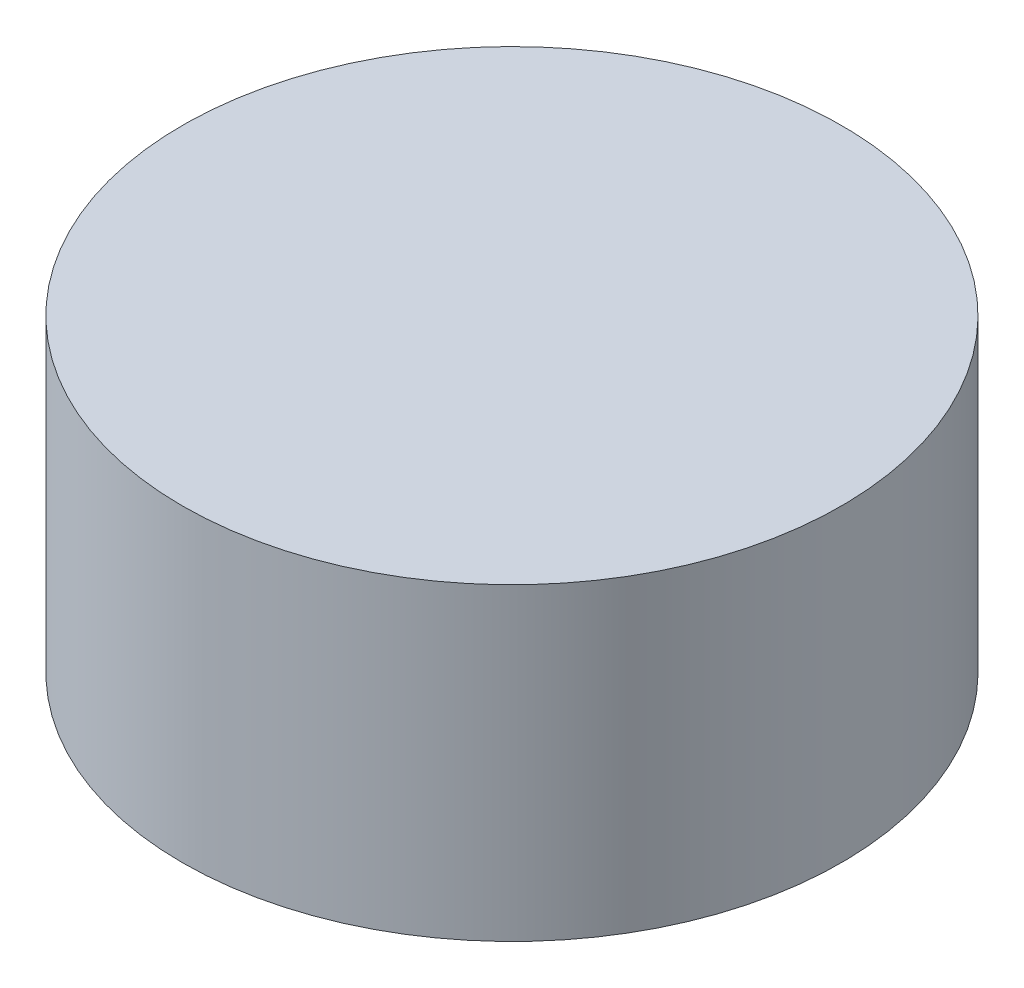
ISO-10303-21;
HEADER;
FILE_DESCRIPTION(('STEP AP214'),'2;1');
FILE_NAME('part.step','',(''),(''),'','','');
FILE_SCHEMA(('AUTOMOTIVE_DESIGN { 1 0 10303 214 1 1 1 1 }'));
ENDSEC;
DATA;
#1=APPLICATION_CONTEXT('core data for automotive mechanical design processes');
#2=APPLICATION_PROTOCOL_DEFINITION('international standard','automotive_design',2000,#1);
#3=PRODUCT_CONTEXT('',#1,'mechanical');
#4=PRODUCT('Part','Part','',(#3));
#5=PRODUCT_RELATED_PRODUCT_CATEGORY('part','',(#4));
#6=PRODUCT_DEFINITION_FORMATION('','',#4);
#7=PRODUCT_DEFINITION_CONTEXT('part definition',#1,'design');
#8=PRODUCT_DEFINITION('design','',#6,#7);
#9=PRODUCT_DEFINITION_SHAPE('','',#8);
#10=(LENGTH_UNIT() NAMED_UNIT(*) SI_UNIT(.MILLI.,.METRE.));
#11=(NAMED_UNIT(*) PLANE_ANGLE_UNIT() SI_UNIT($,.RADIAN.));
#12=(NAMED_UNIT(*) SI_UNIT($,.STERADIAN.) SOLID_ANGLE_UNIT());
#13=UNCERTAINTY_MEASURE_WITH_UNIT(LENGTH_MEASURE(1.E-05),#10,'distance_accuracy_value','');
#14=(GEOMETRIC_REPRESENTATION_CONTEXT(3) GLOBAL_UNCERTAINTY_ASSIGNED_CONTEXT((#13)) GLOBAL_UNIT_ASSIGNED_CONTEXT((#10,
#11,#12)) REPRESENTATION_CONTEXT('',''));
#15=CARTESIAN_POINT('',(0.,0.,0.));
#16=DIRECTION('',(0.,0.,1.));
#17=DIRECTION('',(1.,0.,0.));
#18=AXIS2_PLACEMENT_3D('',#15,#16,#17);
#19=CARTESIAN_POINT('',(0.,280.,0.));
#20=DIRECTION('',(0.,-1.,0.));
#21=DIRECTION('',(0.,0.,-1.));
#22=AXIS2_PLACEMENT_3D('',#19,#20,#21);
#23=CYLINDRICAL_SURFACE('',#22,16.);
#24=CARTESIAN_POINT('',(0.,280.,0.));
#25=DIRECTION('',(0.,1.,0.));
#26=DIRECTION('',(0.,0.,1.));
#27=AXIS2_PLACEMENT_3D('',#24,#25,#26);
#28=CIRCLE('',#27,16.);
#29=CARTESIAN_POINT('',(0.,280.,16.));
#30=VERTEX_POINT('',#29);
#31=EDGE_CURVE('E10',#30,#30,#28,.T.);
#32=ORIENTED_EDGE('',*,*,#31,.F.);
#33=EDGE_LOOP('',(#32));
#34=FACE_BOUND('',#33,.T.);
#35=CARTESIAN_POINT('',(0.,265.,0.));
#36=DIRECTION('',(0.,1.,0.));
#37=DIRECTION('',(0.,0.,1.));
#38=AXIS2_PLACEMENT_3D('',#35,#36,#37);
#39=CIRCLE('',#38,16.);
#40=CARTESIAN_POINT('',(0.,265.,16.));
#41=VERTEX_POINT('',#40);
#42=EDGE_CURVE('E40',#41,#41,#39,.T.);
#43=ORIENTED_EDGE('',*,*,#42,.T.);
#44=EDGE_LOOP('',(#43));
#45=FACE_BOUND('',#44,.T.);
#46=ADVANCED_FACE('F37',(#34,#45),#23,.T.);
#47=CARTESIAN_POINT('',(0.,280.,0.));
#48=DIRECTION('',(0.,1.,0.));
#49=DIRECTION('',(0.,0.,1.));
#50=AXIS2_PLACEMENT_3D('',#47,#48,#49);
#51=PLANE('',#50);
#52=ORIENTED_EDGE('',*,*,#31,.T.);
#53=EDGE_LOOP('',(#52));
#54=FACE_BOUND('',#53,.T.);
#55=ADVANCED_FACE('F52',(#54),#51,.T.);
#56=CARTESIAN_POINT('',(0.,265.,0.));
#57=DIRECTION('',(0.,1.,0.));
#58=DIRECTION('',(0.,0.,1.));
#59=AXIS2_PLACEMENT_3D('',#56,#57,#58);
#60=PLANE('',#59);
#61=ORIENTED_EDGE('',*,*,#42,.F.);
#62=EDGE_LOOP('',(#61));
#63=FACE_BOUND('',#62,.T.);
#64=ADVANCED_FACE('F50',(#63),#60,.F.);
#65=CLOSED_SHELL('',(#46,#55,#64));
#66=MANIFOLD_SOLID_BREP('B2',#65);
#67=ADVANCED_BREP_SHAPE_REPRESENTATION('',(#18,#66),#14);
#68=SHAPE_DEFINITION_REPRESENTATION(#9,#67);
ENDSEC;
END-ISO-10303-21;
